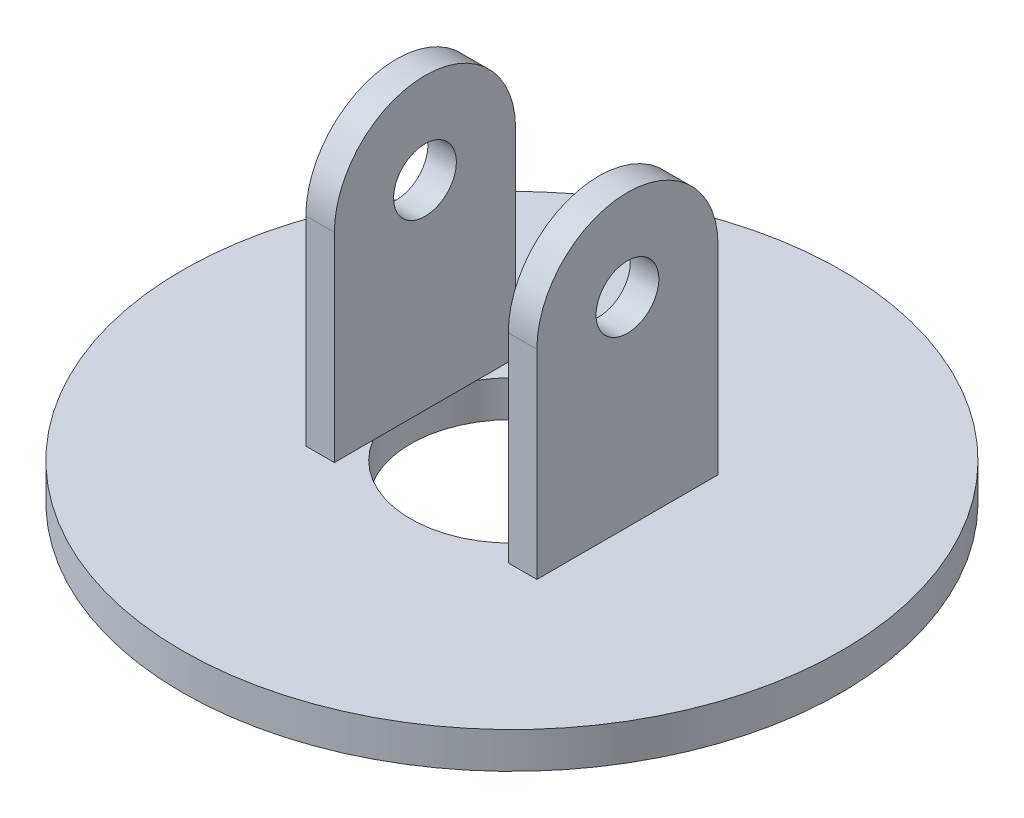
ISO-10303-21;
HEADER;
FILE_DESCRIPTION(('STEP AP214'),'2;1');
FILE_NAME('part.step','',(''),(''),'','','');
FILE_SCHEMA(('AUTOMOTIVE_DESIGN { 1 0 10303 214 1 1 1 1 }'));
ENDSEC;
DATA;
#1=APPLICATION_CONTEXT('core data for automotive mechanical design processes');
#2=APPLICATION_PROTOCOL_DEFINITION('international standard','automotive_design',2000,#1);
#3=PRODUCT_CONTEXT('',#1,'mechanical');
#4=PRODUCT('Part','Part','',(#3));
#5=PRODUCT_RELATED_PRODUCT_CATEGORY('part','',(#4));
#6=PRODUCT_DEFINITION_FORMATION('','',#4);
#7=PRODUCT_DEFINITION_CONTEXT('part definition',#1,'design');
#8=PRODUCT_DEFINITION('design','',#6,#7);
#9=PRODUCT_DEFINITION_SHAPE('','',#8);
#10=(LENGTH_UNIT() NAMED_UNIT(*) SI_UNIT(.MILLI.,.METRE.));
#11=(NAMED_UNIT(*) PLANE_ANGLE_UNIT() SI_UNIT($,.RADIAN.));
#12=(NAMED_UNIT(*) SI_UNIT($,.STERADIAN.) SOLID_ANGLE_UNIT());
#13=UNCERTAINTY_MEASURE_WITH_UNIT(LENGTH_MEASURE(1.E-05),#10,'distance_accuracy_value','');
#14=(GEOMETRIC_REPRESENTATION_CONTEXT(3) GLOBAL_UNCERTAINTY_ASSIGNED_CONTEXT((#13)) GLOBAL_UNIT_ASSIGNED_CONTEXT((#10,
#11,#12)) REPRESENTATION_CONTEXT('',''));
#15=CARTESIAN_POINT('',(0.,0.,0.));
#16=DIRECTION('',(0.,0.,1.));
#17=DIRECTION('',(1.,0.,0.));
#18=AXIS2_PLACEMENT_3D('',#15,#16,#17);
#19=CARTESIAN_POINT('',(-40.48,82.55,0.));
#20=DIRECTION('',(-1.,0.,0.));
#21=DIRECTION('',(0.,0.,1.));
#22=AXIS2_PLACEMENT_3D('',#19,#20,#21);
#23=CYLINDRICAL_SURFACE('',#22,31.75);
#24=DIRECTION('',(-1.,0.,0.));
#25=VECTOR('',#24,1.);
#26=CARTESIAN_POINT('',(-40.48,82.55,-31.75));
#27=LINE('',#26,#25);
#28=CARTESIAN_POINT('',(-40.48,82.55,-31.75));
#29=VERTEX_POINT('',#28);
#30=CARTESIAN_POINT('',(-30.48,82.55,-31.75));
#31=VERTEX_POINT('',#30);
#32=EDGE_CURVE('E227',#29,#31,#27,.F.);
#33=ORIENTED_EDGE('',*,*,#32,.F.);
#34=CARTESIAN_POINT('',(-40.48,82.55,0.));
#35=DIRECTION('',(1.,0.,0.));
#36=DIRECTION('',(0.,0.,-1.));
#37=AXIS2_PLACEMENT_3D('',#34,#35,#36);
#38=CIRCLE('',#37,31.75);
#39=CARTESIAN_POINT('',(-40.48,82.55,31.75));
#40=VERTEX_POINT('',#39);
#41=EDGE_CURVE('E63',#40,#29,#38,.F.);
#42=ORIENTED_EDGE('',*,*,#41,.F.);
#43=DIRECTION('',(-1.,0.,0.));
#44=VECTOR('',#43,1.);
#45=CARTESIAN_POINT('',(-40.48,82.55,31.75));
#46=LINE('',#45,#44);
#47=CARTESIAN_POINT('',(-30.48,82.55,31.75));
#48=VERTEX_POINT('',#47);
#49=EDGE_CURVE('E230',#48,#40,#46,.T.);
#50=ORIENTED_EDGE('',*,*,#49,.F.);
#51=CARTESIAN_POINT('',(-30.48,82.55,0.));
#52=DIRECTION('',(-1.,0.,0.));
#53=DIRECTION('',(0.,0.,1.));
#54=AXIS2_PLACEMENT_3D('',#51,#52,#53);
#55=CIRCLE('',#54,31.75);
#56=EDGE_CURVE('E11',#31,#48,#55,.F.);
#57=ORIENTED_EDGE('',*,*,#56,.F.);
#58=EDGE_LOOP('',(#33,#42,#50,#57));
#59=FACE_BOUND('',#58,.T.);
#60=ADVANCED_FACE('F53',(#59),#23,.T.);
#61=CARTESIAN_POINT('',(40.48,82.55,0.));
#62=DIRECTION('',(1.,0.,0.));
#63=DIRECTION('',(0.,0.,-1.));
#64=AXIS2_PLACEMENT_3D('',#61,#62,#63);
#65=CYLINDRICAL_SURFACE('',#64,31.75);
#66=DIRECTION('',(-1.,0.,0.));
#67=VECTOR('',#66,1.);
#68=CARTESIAN_POINT('',(40.48,82.55,31.75));
#69=LINE('',#68,#67);
#70=CARTESIAN_POINT('',(40.48,82.55,31.75));
#71=VERTEX_POINT('',#70);
#72=CARTESIAN_POINT('',(30.48,82.55,31.75));
#73=VERTEX_POINT('',#72);
#74=EDGE_CURVE('E213',#71,#73,#69,.T.);
#75=ORIENTED_EDGE('',*,*,#74,.F.);
#76=CARTESIAN_POINT('',(40.48,82.55,0.));
#77=DIRECTION('',(-1.,0.,0.));
#78=DIRECTION('',(0.,0.,1.));
#79=AXIS2_PLACEMENT_3D('',#76,#77,#78);
#80=CIRCLE('',#79,31.75);
#81=CARTESIAN_POINT('',(40.48,82.55,-31.75));
#82=VERTEX_POINT('',#81);
#83=EDGE_CURVE('E221',#82,#71,#80,.F.);
#84=ORIENTED_EDGE('',*,*,#83,.F.);
#85=DIRECTION('',(-1.,0.,0.));
#86=VECTOR('',#85,1.);
#87=CARTESIAN_POINT('',(40.48,82.55,-31.75));
#88=LINE('',#87,#86);
#89=CARTESIAN_POINT('',(30.48,82.55,-31.75));
#90=VERTEX_POINT('',#89);
#91=EDGE_CURVE('E217',#90,#82,#88,.F.);
#92=ORIENTED_EDGE('',*,*,#91,.F.);
#93=CARTESIAN_POINT('',(30.48,82.55,0.));
#94=DIRECTION('',(1.,0.,0.));
#95=DIRECTION('',(0.,0.,-1.));
#96=AXIS2_PLACEMENT_3D('',#93,#94,#95);
#97=CIRCLE('',#96,31.75);
#98=EDGE_CURVE('E224',#73,#90,#97,.F.);
#99=ORIENTED_EDGE('',*,*,#98,.F.);
#100=EDGE_LOOP('',(#75,#84,#92,#99));
#101=FACE_BOUND('',#100,.T.);
#102=ADVANCED_FACE('F294',(#101),#65,.T.);
#103=CARTESIAN_POINT('',(0.,12.7,0.));
#104=DIRECTION('',(0.,1.,0.));
#105=DIRECTION('',(0.,0.,1.));
#106=AXIS2_PLACEMENT_3D('',#103,#104,#105);
#107=PLANE('',#106);
#108=CARTESIAN_POINT('',(0.,12.7,0.));
#109=DIRECTION('',(0.,1.,0.));
#110=DIRECTION('',(0.,0.,1.));
#111=AXIS2_PLACEMENT_3D('',#108,#109,#110);
#112=CIRCLE('',#111,115.5);
#113=CARTESIAN_POINT('',(0.,12.7,115.5));
#114=VERTEX_POINT('',#113);
#115=EDGE_CURVE('E206',#114,#114,#112,.T.);
#116=ORIENTED_EDGE('',*,*,#115,.T.);
#117=EDGE_LOOP('',(#116));
#118=FACE_BOUND('',#117,.T.);
#119=CARTESIAN_POINT('',(0.,12.7,0.));
#120=DIRECTION('',(0.,1.,0.));
#121=DIRECTION('',(0.,0.,1.));
#122=AXIS2_PLACEMENT_3D('',#119,#120,#121);
#123=CIRCLE('',#122,35.5);
#124=CARTESIAN_POINT('',(-30.48,12.7,18.1994395518104));
#125=VERTEX_POINT('',#124);
#126=CARTESIAN_POINT('',(30.48,12.7,18.1994395518104));
#127=VERTEX_POINT('',#126);
#128=EDGE_CURVE('E202',#125,#127,#123,.T.);
#129=ORIENTED_EDGE('',*,*,#128,.F.);
#130=DIRECTION('',(0.,0.,-1.));
#131=VECTOR('',#130,1.);
#132=CARTESIAN_POINT('',(-30.48,12.7,31.75));
#133=LINE('',#132,#131);
#134=CARTESIAN_POINT('',(-30.48,12.7,31.75));
#135=VERTEX_POINT('',#134);
#136=EDGE_CURVE('E165',#135,#125,#133,.T.);
#137=ORIENTED_EDGE('',*,*,#136,.F.);
#138=DIRECTION('',(1.,0.,0.));
#139=VECTOR('',#138,1.);
#140=CARTESIAN_POINT('',(-40.48,12.7,31.75));
#141=LINE('',#140,#139);
#142=CARTESIAN_POINT('',(-40.48,12.7,31.75));
#143=VERTEX_POINT('',#142);
#144=EDGE_CURVE('E154',#143,#135,#141,.T.);
#145=ORIENTED_EDGE('',*,*,#144,.F.);
#146=DIRECTION('',(0.,0.,1.));
#147=VECTOR('',#146,1.);
#148=CARTESIAN_POINT('',(-40.48,12.7,31.75));
#149=LINE('',#148,#147);
#150=CARTESIAN_POINT('',(-40.48,12.7,-31.75));
#151=VERTEX_POINT('',#150);
#152=EDGE_CURVE('E134',#151,#143,#149,.T.);
#153=ORIENTED_EDGE('',*,*,#152,.F.);
#154=DIRECTION('',(-1.,0.,0.));
#155=VECTOR('',#154,1.);
#156=CARTESIAN_POINT('',(-40.48,12.7,-31.75));
#157=LINE('',#156,#155);
#158=CARTESIAN_POINT('',(-30.48,12.7,-31.75));
#159=VERTEX_POINT('',#158);
#160=EDGE_CURVE('E139',#159,#151,#157,.T.);
#161=ORIENTED_EDGE('',*,*,#160,.F.);
#162=CARTESIAN_POINT('',(-30.48,12.7,-18.1994395518104));
#163=VERTEX_POINT('',#162);
#164=EDGE_CURVE('E148',#163,#159,#133,.T.);
#165=ORIENTED_EDGE('',*,*,#164,.F.);
#166=CARTESIAN_POINT('',(30.48,12.7,-18.1994395518104));
#167=VERTEX_POINT('',#166);
#168=EDGE_CURVE('E201',#167,#163,#123,.T.);
#169=ORIENTED_EDGE('',*,*,#168,.F.);
#170=DIRECTION('',(0.,0.,1.));
#171=VECTOR('',#170,1.);
#172=CARTESIAN_POINT('',(30.48,12.7,31.75));
#173=LINE('',#172,#171);
#174=CARTESIAN_POINT('',(30.48,12.7,-31.75));
#175=VERTEX_POINT('',#174);
#176=EDGE_CURVE('E162',#175,#167,#173,.T.);
#177=ORIENTED_EDGE('',*,*,#176,.F.);
#178=DIRECTION('',(-1.,0.,0.));
#179=VECTOR('',#178,1.);
#180=CARTESIAN_POINT('',(40.48,12.7,-31.75));
#181=LINE('',#180,#179);
#182=CARTESIAN_POINT('',(40.48,12.7,-31.75));
#183=VERTEX_POINT('',#182);
#184=EDGE_CURVE('E179',#183,#175,#181,.T.);
#185=ORIENTED_EDGE('',*,*,#184,.F.);
#186=DIRECTION('',(0.,0.,-1.));
#187=VECTOR('',#186,1.);
#188=CARTESIAN_POINT('',(40.48,12.7,31.75));
#189=LINE('',#188,#187);
#190=CARTESIAN_POINT('',(40.48,12.7,31.75));
#191=VERTEX_POINT('',#190);
#192=EDGE_CURVE('E175',#191,#183,#189,.T.);
#193=ORIENTED_EDGE('',*,*,#192,.F.);
#194=DIRECTION('',(1.,0.,0.));
#195=VECTOR('',#194,1.);
#196=CARTESIAN_POINT('',(40.48,12.7,31.75));
#197=LINE('',#196,#195);
#198=CARTESIAN_POINT('',(30.48,12.7,31.75));
#199=VERTEX_POINT('',#198);
#200=EDGE_CURVE('E171',#199,#191,#197,.T.);
#201=ORIENTED_EDGE('',*,*,#200,.F.);
#202=EDGE_CURVE('E164',#127,#199,#173,.T.);
#203=ORIENTED_EDGE('',*,*,#202,.F.);
#204=EDGE_LOOP('',(#129,#137,#145,#153,#161,#165,#169,#177,#185,#193,#201,#203));
#205=FACE_BOUND('',#204,.T.);
#206=ADVANCED_FACE('F151',(#118,#205),#107,.T.);
#207=CARTESIAN_POINT('',(0.,0.,0.));
#208=DIRECTION('',(0.,1.,0.));
#209=DIRECTION('',(0.,0.,1.));
#210=AXIS2_PLACEMENT_3D('',#207,#208,#209);
#211=PLANE('',#210);
#212=CARTESIAN_POINT('',(0.,0.,0.));
#213=DIRECTION('',(0.,1.,0.));
#214=DIRECTION('',(0.,0.,1.));
#215=AXIS2_PLACEMENT_3D('',#212,#213,#214);
#216=CIRCLE('',#215,115.5);
#217=CARTESIAN_POINT('',(0.,0.,115.5));
#218=VERTEX_POINT('',#217);
#219=EDGE_CURVE('E200',#218,#218,#216,.T.);
#220=ORIENTED_EDGE('',*,*,#219,.F.);
#221=EDGE_LOOP('',(#220));
#222=FACE_BOUND('',#221,.T.);
#223=CARTESIAN_POINT('',(0.,0.,0.));
#224=DIRECTION('',(0.,1.,0.));
#225=DIRECTION('',(0.,0.,1.));
#226=AXIS2_PLACEMENT_3D('',#223,#224,#225);
#227=CIRCLE('',#226,35.5);
#228=CARTESIAN_POINT('',(0.,0.,35.5));
#229=VERTEX_POINT('',#228);
#230=EDGE_CURVE('E195',#229,#229,#227,.T.);
#231=ORIENTED_EDGE('',*,*,#230,.T.);
#232=EDGE_LOOP('',(#231));
#233=FACE_BOUND('',#232,.T.);
#234=ADVANCED_FACE('F300',(#222,#233),#211,.F.);
#235=CARTESIAN_POINT('',(0.,12.7,0.));
#236=DIRECTION('',(0.,-1.,0.));
#237=DIRECTION('',(0.,0.,-1.));
#238=AXIS2_PLACEMENT_3D('',#235,#236,#237);
#239=CYLINDRICAL_SURFACE('',#238,115.5);
#240=ORIENTED_EDGE('',*,*,#115,.F.);
#241=EDGE_LOOP('',(#240));
#242=FACE_BOUND('',#241,.T.);
#243=ORIENTED_EDGE('',*,*,#219,.T.);
#244=EDGE_LOOP('',(#243));
#245=FACE_BOUND('',#244,.T.);
#246=ADVANCED_FACE('F307',(#242,#245),#239,.T.);
#247=CARTESIAN_POINT('',(0.,12.7,0.));
#248=DIRECTION('',(0.,-1.,0.));
#249=DIRECTION('',(0.,0.,-1.));
#250=AXIS2_PLACEMENT_3D('',#247,#248,#249);
#251=CYLINDRICAL_SURFACE('',#250,35.5);
#252=EDGE_CURVE('E196',#127,#167,#123,.T.);
#253=ORIENTED_EDGE('',*,*,#252,.T.);
#254=ORIENTED_EDGE('',*,*,#168,.T.);
#255=EDGE_CURVE('E252',#163,#125,#123,.T.);
#256=ORIENTED_EDGE('',*,*,#255,.T.);
#257=ORIENTED_EDGE('',*,*,#128,.T.);
#258=EDGE_LOOP('',(#253,#254,#256,#257));
#259=FACE_BOUND('',#258,.T.);
#260=ORIENTED_EDGE('',*,*,#230,.F.);
#261=EDGE_LOOP('',(#260));
#262=FACE_BOUND('',#261,.T.);
#263=ADVANCED_FACE('F269',(#259,#262),#251,.F.);
#264=CARTESIAN_POINT('',(30.48,114.3,31.75));
#265=DIRECTION('',(1.,0.,0.));
#266=DIRECTION('',(0.,0.,-1.));
#267=AXIS2_PLACEMENT_3D('',#264,#265,#266);
#268=PLANE('',#267);
#269=CARTESIAN_POINT('',(30.48,82.55,0.));
#270=DIRECTION('',(1.,0.,0.));
#271=DIRECTION('',(0.,0.,-1.));
#272=AXIS2_PLACEMENT_3D('',#269,#270,#271);
#273=CIRCLE('',#272,11.);
#274=CARTESIAN_POINT('',(30.48,82.55,-11.));
#275=VERTEX_POINT('',#274);
#276=EDGE_CURVE('E359',#275,#275,#273,.T.);
#277=ORIENTED_EDGE('',*,*,#276,.T.);
#278=EDGE_LOOP('',(#277));
#279=FACE_BOUND('',#278,.T.);
#280=DIRECTION('',(0.,-1.,0.));
#281=VECTOR('',#280,1.);
#282=CARTESIAN_POINT('',(30.48,114.3,31.75));
#283=LINE('',#282,#281);
#284=EDGE_CURVE('E192',#73,#199,#283,.T.);
#285=ORIENTED_EDGE('',*,*,#284,.F.);
#286=ORIENTED_EDGE('',*,*,#98,.T.);
#287=DIRECTION('',(0.,-1.,0.));
#288=VECTOR('',#287,1.);
#289=CARTESIAN_POINT('',(30.48,114.3,-31.75));
#290=LINE('',#289,#288);
#291=EDGE_CURVE('E183',#90,#175,#290,.T.);
#292=ORIENTED_EDGE('',*,*,#291,.T.);
#293=ORIENTED_EDGE('',*,*,#176,.T.);
#294=EDGE_CURVE('E156',#167,#127,#173,.T.);
#295=ORIENTED_EDGE('',*,*,#294,.T.);
#296=ORIENTED_EDGE('',*,*,#202,.T.);
#297=EDGE_LOOP('',(#285,#286,#292,#293,#295,#296));
#298=FACE_BOUND('',#297,.T.);
#299=ADVANCED_FACE('F279',(#279,#298),#268,.F.);
#300=CARTESIAN_POINT('',(40.48,114.3,31.75));
#301=DIRECTION('',(0.,0.,-1.));
#302=DIRECTION('',(-1.,0.,0.));
#303=AXIS2_PLACEMENT_3D('',#300,#301,#302);
#304=PLANE('',#303);
#305=DIRECTION('',(0.,-1.,0.));
#306=VECTOR('',#305,1.);
#307=CARTESIAN_POINT('',(40.48,114.3,31.75));
#308=LINE('',#307,#306);
#309=EDGE_CURVE('E189',#71,#191,#308,.T.);
#310=ORIENTED_EDGE('',*,*,#309,.F.);
#311=ORIENTED_EDGE('',*,*,#74,.T.);
#312=ORIENTED_EDGE('',*,*,#284,.T.);
#313=ORIENTED_EDGE('',*,*,#200,.T.);
#314=EDGE_LOOP('',(#310,#311,#312,#313));
#315=FACE_BOUND('',#314,.T.);
#316=ADVANCED_FACE('F292',(#315),#304,.F.);
#317=CARTESIAN_POINT('',(40.48,114.3,31.75));
#318=DIRECTION('',(-1.,0.,0.));
#319=DIRECTION('',(0.,0.,1.));
#320=AXIS2_PLACEMENT_3D('',#317,#318,#319);
#321=PLANE('',#320);
#322=CARTESIAN_POINT('',(40.48,82.55,0.));
#323=DIRECTION('',(-1.,0.,0.));
#324=DIRECTION('',(0.,0.,1.));
#325=AXIS2_PLACEMENT_3D('',#322,#323,#324);
#326=CIRCLE('',#325,11.);
#327=CARTESIAN_POINT('',(40.48,82.55,11.));
#328=VERTEX_POINT('',#327);
#329=EDGE_CURVE('E356',#328,#328,#326,.T.);
#330=ORIENTED_EDGE('',*,*,#329,.T.);
#331=EDGE_LOOP('',(#330));
#332=FACE_BOUND('',#331,.T.);
#333=DIRECTION('',(0.,-1.,0.));
#334=VECTOR('',#333,1.);
#335=CARTESIAN_POINT('',(40.48,114.3,-31.75));
#336=LINE('',#335,#334);
#337=EDGE_CURVE('E186',#82,#183,#336,.T.);
#338=ORIENTED_EDGE('',*,*,#337,.F.);
#339=ORIENTED_EDGE('',*,*,#83,.T.);
#340=ORIENTED_EDGE('',*,*,#309,.T.);
#341=ORIENTED_EDGE('',*,*,#192,.T.);
#342=EDGE_LOOP('',(#338,#339,#340,#341));
#343=FACE_BOUND('',#342,.T.);
#344=ADVANCED_FACE('F288',(#332,#343),#321,.F.);
#345=CARTESIAN_POINT('',(40.48,114.3,-31.75));
#346=DIRECTION('',(0.,0.,1.));
#347=DIRECTION('',(1.,0.,0.));
#348=AXIS2_PLACEMENT_3D('',#345,#346,#347);
#349=PLANE('',#348);
#350=ORIENTED_EDGE('',*,*,#291,.F.);
#351=ORIENTED_EDGE('',*,*,#91,.T.);
#352=ORIENTED_EDGE('',*,*,#337,.T.);
#353=ORIENTED_EDGE('',*,*,#184,.T.);
#354=EDGE_LOOP('',(#350,#351,#352,#353));
#355=FACE_BOUND('',#354,.T.);
#356=ADVANCED_FACE('F284',(#355),#349,.F.);
#357=CARTESIAN_POINT('',(0.,12.7,0.));
#358=DIRECTION('',(0.,1.,0.));
#359=DIRECTION('',(0.,0.,1.));
#360=AXIS2_PLACEMENT_3D('',#357,#358,#359);
#361=PLANE('',#360);
#362=ORIENTED_EDGE('',*,*,#252,.F.);
#363=ORIENTED_EDGE('',*,*,#294,.F.);
#364=EDGE_LOOP('',(#362,#363));
#365=FACE_BOUND('',#364,.T.);
#366=ADVANCED_FACE('F278',(#365),#361,.F.);
#367=CARTESIAN_POINT('',(0.,12.7,0.));
#368=DIRECTION('',(0.,-1.,0.));
#369=DIRECTION('',(0.,0.,-1.));
#370=AXIS2_PLACEMENT_3D('',#367,#368,#369);
#371=PLANE('',#370);
#372=EDGE_CURVE('E375',#125,#163,#133,.T.);
#373=ORIENTED_EDGE('',*,*,#372,.F.);
#374=ORIENTED_EDGE('',*,*,#255,.F.);
#375=EDGE_LOOP('',(#373,#374));
#376=FACE_BOUND('',#375,.T.);
#377=ADVANCED_FACE('F328',(#376),#371,.T.);
#378=CARTESIAN_POINT('',(-40.48,114.3,31.75));
#379=DIRECTION('',(1.,0.,0.));
#380=DIRECTION('',(0.,0.,-1.));
#381=AXIS2_PLACEMENT_3D('',#378,#379,#380);
#382=PLANE('',#381);
#383=CARTESIAN_POINT('',(-40.48,82.55,0.));
#384=DIRECTION('',(-1.,0.,0.));
#385=DIRECTION('',(0.,0.,1.));
#386=AXIS2_PLACEMENT_3D('',#383,#384,#385);
#387=CIRCLE('',#386,11.);
#388=CARTESIAN_POINT('',(-40.48,82.55,11.));
#389=VERTEX_POINT('',#388);
#390=EDGE_CURVE('E390',#389,#389,#387,.T.);
#391=ORIENTED_EDGE('',*,*,#390,.F.);
#392=EDGE_LOOP('',(#391));
#393=FACE_BOUND('',#392,.T.);
#394=DIRECTION('',(0.,-1.,0.));
#395=VECTOR('',#394,1.);
#396=CARTESIAN_POINT('',(-40.48,114.3,31.75));
#397=LINE('',#396,#395);
#398=EDGE_CURVE('E361',#40,#143,#397,.T.);
#399=ORIENTED_EDGE('',*,*,#398,.F.);
#400=ORIENTED_EDGE('',*,*,#41,.T.);
#401=DIRECTION('',(0.,-1.,0.));
#402=VECTOR('',#401,1.);
#403=CARTESIAN_POINT('',(-40.48,114.3,-31.75));
#404=LINE('',#403,#402);
#405=EDGE_CURVE('E129',#29,#151,#404,.T.);
#406=ORIENTED_EDGE('',*,*,#405,.T.);
#407=ORIENTED_EDGE('',*,*,#152,.T.);
#408=EDGE_LOOP('',(#399,#400,#406,#407));
#409=FACE_BOUND('',#408,.T.);
#410=ADVANCED_FACE('F132',(#393,#409),#382,.F.);
#411=CARTESIAN_POINT('',(-40.48,114.3,31.75));
#412=DIRECTION('',(0.,0.,-1.));
#413=DIRECTION('',(-1.,0.,0.));
#414=AXIS2_PLACEMENT_3D('',#411,#412,#413);
#415=PLANE('',#414);
#416=DIRECTION('',(0.,-1.,0.));
#417=VECTOR('',#416,1.);
#418=CARTESIAN_POINT('',(-30.48,114.3,31.75));
#419=LINE('',#418,#417);
#420=EDGE_CURVE('E366',#48,#135,#419,.T.);
#421=ORIENTED_EDGE('',*,*,#420,.F.);
#422=ORIENTED_EDGE('',*,*,#49,.T.);
#423=ORIENTED_EDGE('',*,*,#398,.T.);
#424=ORIENTED_EDGE('',*,*,#144,.T.);
#425=EDGE_LOOP('',(#421,#422,#423,#424));
#426=FACE_BOUND('',#425,.T.);
#427=ADVANCED_FACE('F338',(#426),#415,.F.);
#428=CARTESIAN_POINT('',(-30.48,114.3,31.75));
#429=DIRECTION('',(-1.,0.,0.));
#430=DIRECTION('',(0.,0.,1.));
#431=AXIS2_PLACEMENT_3D('',#428,#429,#430);
#432=PLANE('',#431);
#433=CARTESIAN_POINT('',(-30.48,82.55,0.));
#434=DIRECTION('',(-1.,0.,0.));
#435=DIRECTION('',(0.,0.,1.));
#436=AXIS2_PLACEMENT_3D('',#433,#434,#435);
#437=CIRCLE('',#436,11.);
#438=CARTESIAN_POINT('',(-30.48,82.55,11.));
#439=VERTEX_POINT('',#438);
#440=EDGE_CURVE('E57',#439,#439,#437,.T.);
#441=ORIENTED_EDGE('',*,*,#440,.T.);
#442=EDGE_LOOP('',(#441));
#443=FACE_BOUND('',#442,.T.);
#444=DIRECTION('',(0.,-1.,0.));
#445=VECTOR('',#444,1.);
#446=CARTESIAN_POINT('',(-30.48,114.3,-31.75));
#447=LINE('',#446,#445);
#448=EDGE_CURVE('E140',#31,#159,#447,.T.);
#449=ORIENTED_EDGE('',*,*,#448,.F.);
#450=ORIENTED_EDGE('',*,*,#56,.T.);
#451=ORIENTED_EDGE('',*,*,#420,.T.);
#452=ORIENTED_EDGE('',*,*,#136,.T.);
#453=ORIENTED_EDGE('',*,*,#372,.T.);
#454=ORIENTED_EDGE('',*,*,#164,.T.);
#455=EDGE_LOOP('',(#449,#450,#451,#452,#453,#454));
#456=FACE_BOUND('',#455,.T.);
#457=ADVANCED_FACE('F335',(#443,#456),#432,.F.);
#458=CARTESIAN_POINT('',(-40.48,114.3,-31.75));
#459=DIRECTION('',(0.,0.,1.));
#460=DIRECTION('',(1.,0.,0.));
#461=AXIS2_PLACEMENT_3D('',#458,#459,#460);
#462=PLANE('',#461);
#463=ORIENTED_EDGE('',*,*,#405,.F.);
#464=ORIENTED_EDGE('',*,*,#32,.T.);
#465=ORIENTED_EDGE('',*,*,#448,.T.);
#466=ORIENTED_EDGE('',*,*,#160,.T.);
#467=EDGE_LOOP('',(#463,#464,#465,#466));
#468=FACE_BOUND('',#467,.T.);
#469=ADVANCED_FACE('F143',(#468),#462,.F.);
#470=CARTESIAN_POINT('',(61.12,82.55,0.));
#471=DIRECTION('',(-1.,0.,0.));
#472=DIRECTION('',(0.,0.,1.));
#473=AXIS2_PLACEMENT_3D('',#470,#471,#472);
#474=CYLINDRICAL_SURFACE('',#473,11.);
#475=ORIENTED_EDGE('',*,*,#390,.T.);
#476=EDGE_LOOP('',(#475));
#477=FACE_BOUND('',#476,.T.);
#478=ORIENTED_EDGE('',*,*,#440,.F.);
#479=EDGE_LOOP('',(#478));
#480=FACE_BOUND('',#479,.T.);
#481=ADVANCED_FACE('F334',(#477,#480),#474,.F.);
#482=ORIENTED_EDGE('',*,*,#329,.F.);
#483=EDGE_LOOP('',(#482));
#484=FACE_BOUND('',#483,.T.);
#485=ORIENTED_EDGE('',*,*,#276,.F.);
#486=EDGE_LOOP('',(#485));
#487=FACE_BOUND('',#486,.T.);
#488=ADVANCED_FACE('F346',(#484,#487),#474,.F.);
#489=CLOSED_SHELL('',(#60,#102,#206,#234,#246,#263,#299,#316,#344,#356,#366,#377,#410,#427,#457,
#469,#481,#488));
#490=MANIFOLD_SOLID_BREP('B2',#489);
#491=ADVANCED_BREP_SHAPE_REPRESENTATION('',(#18,#490),#14);
#492=SHAPE_DEFINITION_REPRESENTATION(#9,#491);
ENDSEC;
END-ISO-10303-21;
